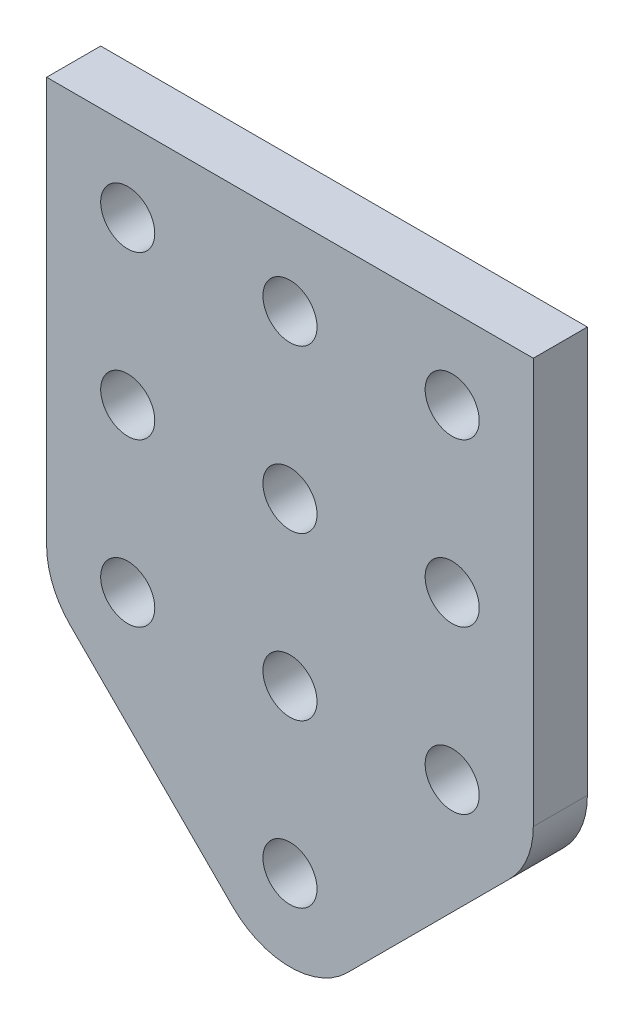
ISO-10303-21;
HEADER;
FILE_DESCRIPTION(('STEP AP214'),'2;1');
FILE_NAME('part.step','',(''),(''),'','','');
FILE_SCHEMA(('AUTOMOTIVE_DESIGN { 1 0 10303 214 1 1 1 1 }'));
ENDSEC;
DATA;
#1=APPLICATION_CONTEXT('core data for automotive mechanical design processes');
#2=APPLICATION_PROTOCOL_DEFINITION('international standard','automotive_design',2000,#1);
#3=PRODUCT_CONTEXT('',#1,'mechanical');
#4=PRODUCT('Part','Part','',(#3));
#5=PRODUCT_RELATED_PRODUCT_CATEGORY('part','',(#4));
#6=PRODUCT_DEFINITION_FORMATION('','',#4);
#7=PRODUCT_DEFINITION_CONTEXT('part definition',#1,'design');
#8=PRODUCT_DEFINITION('design','',#6,#7);
#9=PRODUCT_DEFINITION_SHAPE('','',#8);
#10=(LENGTH_UNIT() NAMED_UNIT(*) SI_UNIT(.MILLI.,.METRE.));
#11=(NAMED_UNIT(*) PLANE_ANGLE_UNIT() SI_UNIT($,.RADIAN.));
#12=(NAMED_UNIT(*) SI_UNIT($,.STERADIAN.) SOLID_ANGLE_UNIT());
#13=UNCERTAINTY_MEASURE_WITH_UNIT(LENGTH_MEASURE(1.E-05),#10,'distance_accuracy_value','');
#14=(GEOMETRIC_REPRESENTATION_CONTEXT(3) GLOBAL_UNCERTAINTY_ASSIGNED_CONTEXT((#13)) GLOBAL_UNIT_ASSIGNED_CONTEXT((#10,
#11,#12)) REPRESENTATION_CONTEXT('',''));
#15=CARTESIAN_POINT('',(0.,0.,0.));
#16=DIRECTION('',(0.,0.,1.));
#17=DIRECTION('',(1.,0.,0.));
#18=AXIS2_PLACEMENT_3D('',#15,#16,#17);
#19=CARTESIAN_POINT('',(187.7270545748,195.1787200631,3.));
#20=DIRECTION('',(0.,0.,1.));
#21=DIRECTION('',(1.,0.,0.));
#22=AXIS2_PLACEMENT_3D('',#19,#20,#21);
#23=PLANE('',#22);
#24=CARTESIAN_POINT('',(178.7270545748,222.1787200631,3.));
#25=DIRECTION('',(0.,0.,1.));
#26=DIRECTION('',(1.,0.,0.));
#27=AXIS2_PLACEMENT_3D('',#24,#25,#26);
#28=CIRCLE('',#27,1.5);
#29=CARTESIAN_POINT('',(180.2270545748,222.1787200631,3.));
#30=VERTEX_POINT('',#29);
#31=EDGE_CURVE('E224',#30,#30,#28,.T.);
#32=ORIENTED_EDGE('',*,*,#31,.F.);
#33=EDGE_LOOP('',(#32));
#34=FACE_BOUND('',#33,.T.);
#35=CARTESIAN_POINT('',(196.7270545748,204.1787200631,3.));
#36=DIRECTION('',(0.,0.,1.));
#37=DIRECTION('',(1.,0.,0.));
#38=AXIS2_PLACEMENT_3D('',#35,#36,#37);
#39=CIRCLE('',#38,1.5);
#40=CARTESIAN_POINT('',(198.2270545748,204.1787200631,3.));
#41=VERTEX_POINT('',#40);
#42=EDGE_CURVE('E212',#41,#41,#39,.T.);
#43=ORIENTED_EDGE('',*,*,#42,.F.);
#44=EDGE_LOOP('',(#43));
#45=FACE_BOUND('',#44,.T.);
#46=CARTESIAN_POINT('',(196.7270545748,213.1787200631,3.));
#47=DIRECTION('',(0.,0.,1.));
#48=DIRECTION('',(1.,0.,0.));
#49=AXIS2_PLACEMENT_3D('',#46,#47,#48);
#50=CIRCLE('',#49,1.5);
#51=CARTESIAN_POINT('',(198.2270545748,213.1787200631,3.));
#52=VERTEX_POINT('',#51);
#53=EDGE_CURVE('E200',#52,#52,#50,.T.);
#54=ORIENTED_EDGE('',*,*,#53,.F.);
#55=EDGE_LOOP('',(#54));
#56=FACE_BOUND('',#55,.T.);
#57=CARTESIAN_POINT('',(187.7270545748,213.1787200631,3.));
#58=DIRECTION('',(0.,0.,1.));
#59=DIRECTION('',(1.,0.,0.));
#60=AXIS2_PLACEMENT_3D('',#57,#58,#59);
#61=CIRCLE('',#60,1.5);
#62=CARTESIAN_POINT('',(189.2270545748,213.1787200631,3.));
#63=VERTEX_POINT('',#62);
#64=EDGE_CURVE('E188',#63,#63,#61,.T.);
#65=ORIENTED_EDGE('',*,*,#64,.F.);
#66=EDGE_LOOP('',(#65));
#67=FACE_BOUND('',#66,.T.);
#68=CARTESIAN_POINT('',(187.7270545748,204.1787200631,3.));
#69=DIRECTION('',(0.,0.,1.));
#70=DIRECTION('',(1.,0.,0.));
#71=AXIS2_PLACEMENT_3D('',#68,#69,#70);
#72=CIRCLE('',#71,1.5);
#73=CARTESIAN_POINT('',(189.2270545748,204.1787200631,3.));
#74=VERTEX_POINT('',#73);
#75=EDGE_CURVE('E133',#74,#74,#72,.T.);
#76=ORIENTED_EDGE('',*,*,#75,.F.);
#77=EDGE_LOOP('',(#76));
#78=FACE_BOUND('',#77,.T.);
#79=CARTESIAN_POINT('',(187.7270545748,195.1787200631,3.));
#80=DIRECTION('',(0.,0.,1.));
#81=DIRECTION('',(1.,0.,0.));
#82=AXIS2_PLACEMENT_3D('',#79,#80,#81);
#83=CIRCLE('',#82,4.50000000005025);
#84=CARTESIAN_POINT('',(184.5450740594,191.9967395477,3.));
#85=VERTEX_POINT('',#84);
#86=CARTESIAN_POINT('',(190.9090350901,191.9967395477,3.));
#87=VERTEX_POINT('',#86);
#88=EDGE_CURVE('E145',#85,#87,#83,.T.);
#89=ORIENTED_EDGE('',*,*,#88,.T.);
#90=DIRECTION('',(0.707106781186548,0.707106781186548,0.));
#91=VECTOR('',#90,1.);
#92=CARTESIAN_POINT('',(190.9090350901,191.9967395477,3.));
#93=LINE('',#92,#91);
#94=CARTESIAN_POINT('',(199.909035090095,200.996739547705,3.));
#95=VERTEX_POINT('',#94);
#96=EDGE_CURVE('E93',#87,#95,#93,.T.);
#97=ORIENTED_EDGE('',*,*,#96,.T.);
#98=CARTESIAN_POINT('',(196.7270545748,204.1787200631,3.));
#99=DIRECTION('',(0.,0.,1.));
#100=DIRECTION('',(1.,0.,0.));
#101=AXIS2_PLACEMENT_3D('',#98,#99,#100);
#102=CIRCLE('',#101,4.50000000000745);
#103=CARTESIAN_POINT('',(201.2270545748,204.1787200631,3.));
#104=VERTEX_POINT('',#103);
#105=EDGE_CURVE('E160',#95,#104,#102,.T.);
#106=ORIENTED_EDGE('',*,*,#105,.T.);
#107=DIRECTION('',(0.,1.,0.));
#108=VECTOR('',#107,1.);
#109=CARTESIAN_POINT('',(201.2270545748,226.6787200631,3.));
#110=LINE('',#109,#108);
#111=CARTESIAN_POINT('',(201.2270545748,226.6787200631,3.));
#112=VERTEX_POINT('',#111);
#113=EDGE_CURVE('E173',#104,#112,#110,.T.);
#114=ORIENTED_EDGE('',*,*,#113,.T.);
#115=DIRECTION('',(-1.,0.,0.));
#116=VECTOR('',#115,1.);
#117=CARTESIAN_POINT('',(201.2270545748,226.6787200631,3.));
#118=LINE('',#117,#116);
#119=CARTESIAN_POINT('',(174.2270545748,226.6787200631,3.));
#120=VERTEX_POINT('',#119);
#121=EDGE_CURVE('E112',#112,#120,#118,.T.);
#122=ORIENTED_EDGE('',*,*,#121,.T.);
#123=DIRECTION('',(0.,-1.,0.));
#124=VECTOR('',#123,1.);
#125=CARTESIAN_POINT('',(174.2270545748,213.1787200631,3.));
#126=LINE('',#125,#124);
#127=CARTESIAN_POINT('',(174.227054574757,204.1787200631,3.));
#128=VERTEX_POINT('',#127);
#129=EDGE_CURVE('E106',#120,#128,#126,.T.);
#130=ORIENTED_EDGE('',*,*,#129,.T.);
#131=CARTESIAN_POINT('',(178.7270545748,204.1787200631,3.));
#132=DIRECTION('',(0.,0.,1.));
#133=DIRECTION('',(1.,0.,0.));
#134=AXIS2_PLACEMENT_3D('',#131,#132,#133);
#135=CIRCLE('',#134,4.50000000004281);
#136=CARTESIAN_POINT('',(175.5450740594,200.9967395477,3.));
#137=VERTEX_POINT('',#136);
#138=EDGE_CURVE('E110',#128,#137,#135,.T.);
#139=ORIENTED_EDGE('',*,*,#138,.T.);
#140=DIRECTION('',(0.707106781186548,-0.707106781186548,0.));
#141=VECTOR('',#140,1.);
#142=CARTESIAN_POINT('',(184.5450740594,191.9967395477,3.));
#143=LINE('',#142,#141);
#144=EDGE_CURVE('E50',#137,#85,#143,.T.);
#145=ORIENTED_EDGE('',*,*,#144,.T.);
#146=EDGE_LOOP('',(#89,#97,#106,#114,#122,#130,#139,#145));
#147=FACE_BOUND('',#146,.T.);
#148=CARTESIAN_POINT('',(178.7270545748,204.1787200631,3.));
#149=DIRECTION('',(0.,0.,1.));
#150=DIRECTION('',(1.,0.,0.));
#151=AXIS2_PLACEMENT_3D('',#148,#149,#150);
#152=CIRCLE('',#151,1.5);
#153=CARTESIAN_POINT('',(180.2270545748,204.1787200631,3.));
#154=VERTEX_POINT('',#153);
#155=EDGE_CURVE('E182',#154,#154,#152,.T.);
#156=ORIENTED_EDGE('',*,*,#155,.F.);
#157=EDGE_LOOP('',(#156));
#158=FACE_BOUND('',#157,.T.);
#159=CARTESIAN_POINT('',(178.7270545748,213.1787200631,3.));
#160=DIRECTION('',(0.,0.,1.));
#161=DIRECTION('',(1.,0.,0.));
#162=AXIS2_PLACEMENT_3D('',#159,#160,#161);
#163=CIRCLE('',#162,1.5);
#164=CARTESIAN_POINT('',(180.2270545748,213.1787200631,3.));
#165=VERTEX_POINT('',#164);
#166=EDGE_CURVE('E194',#165,#165,#163,.T.);
#167=ORIENTED_EDGE('',*,*,#166,.F.);
#168=EDGE_LOOP('',(#167));
#169=FACE_BOUND('',#168,.T.);
#170=CARTESIAN_POINT('',(187.7270545748,195.1787200631,3.));
#171=DIRECTION('',(0.,0.,1.));
#172=DIRECTION('',(1.,0.,0.));
#173=AXIS2_PLACEMENT_3D('',#170,#171,#172);
#174=CIRCLE('',#173,1.5);
#175=CARTESIAN_POINT('',(189.2270545748,195.1787200631,3.));
#176=VERTEX_POINT('',#175);
#177=EDGE_CURVE('E206',#176,#176,#174,.T.);
#178=ORIENTED_EDGE('',*,*,#177,.F.);
#179=EDGE_LOOP('',(#178));
#180=FACE_BOUND('',#179,.T.);
#181=CARTESIAN_POINT('',(187.7270545748,222.1787200631,3.));
#182=DIRECTION('',(0.,0.,1.));
#183=DIRECTION('',(1.,0.,0.));
#184=AXIS2_PLACEMENT_3D('',#181,#182,#183);
#185=CIRCLE('',#184,1.5);
#186=CARTESIAN_POINT('',(189.2270545748,222.1787200631,3.));
#187=VERTEX_POINT('',#186);
#188=EDGE_CURVE('E218',#187,#187,#185,.T.);
#189=ORIENTED_EDGE('',*,*,#188,.F.);
#190=EDGE_LOOP('',(#189));
#191=FACE_BOUND('',#190,.T.);
#192=CARTESIAN_POINT('',(196.7270545748,222.1787200631,3.));
#193=DIRECTION('',(0.,0.,1.));
#194=DIRECTION('',(1.,0.,0.));
#195=AXIS2_PLACEMENT_3D('',#192,#193,#194);
#196=CIRCLE('',#195,1.5);
#197=CARTESIAN_POINT('',(198.2270545748,222.1787200631,3.));
#198=VERTEX_POINT('',#197);
#199=EDGE_CURVE('E230',#198,#198,#196,.T.);
#200=ORIENTED_EDGE('',*,*,#199,.F.);
#201=EDGE_LOOP('',(#200));
#202=FACE_BOUND('',#201,.T.);
#203=ADVANCED_FACE('F33',(#34,#45,#56,#67,#78,#147,#158,#169,#180,#191,#202),#23,.T.);
#204=CARTESIAN_POINT('',(187.7270545748,195.1787200631,0.));
#205=DIRECTION('',(0.,0.,1.));
#206=DIRECTION('',(1.,0.,0.));
#207=AXIS2_PLACEMENT_3D('',#204,#205,#206);
#208=PLANE('',#207);
#209=CARTESIAN_POINT('',(178.7270545748,222.1787200631,0.));
#210=DIRECTION('',(0.,0.,1.));
#211=DIRECTION('',(1.,0.,0.));
#212=AXIS2_PLACEMENT_3D('',#209,#210,#211);
#213=CIRCLE('',#212,1.5);
#214=CARTESIAN_POINT('',(180.2270545748,222.1787200631,0.));
#215=VERTEX_POINT('',#214);
#216=EDGE_CURVE('E227',#215,#215,#213,.T.);
#217=ORIENTED_EDGE('',*,*,#216,.T.);
#218=EDGE_LOOP('',(#217));
#219=FACE_BOUND('',#218,.T.);
#220=CARTESIAN_POINT('',(196.7270545748,204.1787200631,0.));
#221=DIRECTION('',(0.,0.,1.));
#222=DIRECTION('',(1.,0.,0.));
#223=AXIS2_PLACEMENT_3D('',#220,#221,#222);
#224=CIRCLE('',#223,1.5);
#225=CARTESIAN_POINT('',(198.2270545748,204.1787200631,0.));
#226=VERTEX_POINT('',#225);
#227=EDGE_CURVE('E215',#226,#226,#224,.T.);
#228=ORIENTED_EDGE('',*,*,#227,.T.);
#229=EDGE_LOOP('',(#228));
#230=FACE_BOUND('',#229,.T.);
#231=CARTESIAN_POINT('',(196.7270545748,213.1787200631,0.));
#232=DIRECTION('',(0.,0.,1.));
#233=DIRECTION('',(1.,0.,0.));
#234=AXIS2_PLACEMENT_3D('',#231,#232,#233);
#235=CIRCLE('',#234,1.5);
#236=CARTESIAN_POINT('',(198.2270545748,213.1787200631,0.));
#237=VERTEX_POINT('',#236);
#238=EDGE_CURVE('E203',#237,#237,#235,.T.);
#239=ORIENTED_EDGE('',*,*,#238,.T.);
#240=EDGE_LOOP('',(#239));
#241=FACE_BOUND('',#240,.T.);
#242=CARTESIAN_POINT('',(187.7270545748,213.1787200631,0.));
#243=DIRECTION('',(0.,0.,1.));
#244=DIRECTION('',(1.,0.,0.));
#245=AXIS2_PLACEMENT_3D('',#242,#243,#244);
#246=CIRCLE('',#245,1.5);
#247=CARTESIAN_POINT('',(189.2270545748,213.1787200631,0.));
#248=VERTEX_POINT('',#247);
#249=EDGE_CURVE('E191',#248,#248,#246,.T.);
#250=ORIENTED_EDGE('',*,*,#249,.T.);
#251=EDGE_LOOP('',(#250));
#252=FACE_BOUND('',#251,.T.);
#253=CARTESIAN_POINT('',(187.7270545748,204.1787200631,0.));
#254=DIRECTION('',(0.,0.,1.));
#255=DIRECTION('',(1.,0.,0.));
#256=AXIS2_PLACEMENT_3D('',#253,#254,#255);
#257=CIRCLE('',#256,1.5);
#258=CARTESIAN_POINT('',(189.2270545748,204.1787200631,0.));
#259=VERTEX_POINT('',#258);
#260=EDGE_CURVE('E179',#259,#259,#257,.T.);
#261=ORIENTED_EDGE('',*,*,#260,.T.);
#262=EDGE_LOOP('',(#261));
#263=FACE_BOUND('',#262,.T.);
#264=CARTESIAN_POINT('',(187.7270545748,195.1787200631,0.));
#265=DIRECTION('',(0.,0.,1.));
#266=DIRECTION('',(1.,0.,0.));
#267=AXIS2_PLACEMENT_3D('',#264,#265,#266);
#268=CIRCLE('',#267,4.50000000005025);
#269=CARTESIAN_POINT('',(184.5450740594,191.9967395477,0.));
#270=VERTEX_POINT('',#269);
#271=CARTESIAN_POINT('',(190.9090350901,191.9967395477,0.));
#272=VERTEX_POINT('',#271);
#273=EDGE_CURVE('E129',#270,#272,#268,.T.);
#274=ORIENTED_EDGE('',*,*,#273,.F.);
#275=DIRECTION('',(0.707106781186548,-0.707106781186548,0.));
#276=VECTOR('',#275,1.);
#277=CARTESIAN_POINT('',(184.5450740594,191.9967395477,0.));
#278=LINE('',#277,#276);
#279=CARTESIAN_POINT('',(175.5450740594,200.9967395477,0.));
#280=VERTEX_POINT('',#279);
#281=EDGE_CURVE('E85',#280,#270,#278,.T.);
#282=ORIENTED_EDGE('',*,*,#281,.F.);
#283=CARTESIAN_POINT('',(178.7270545748,204.1787200631,0.));
#284=DIRECTION('',(0.,0.,1.));
#285=DIRECTION('',(1.,0.,0.));
#286=AXIS2_PLACEMENT_3D('',#283,#284,#285);
#287=CIRCLE('',#286,4.50000000004281);
#288=CARTESIAN_POINT('',(174.227054574757,204.1787200631,0.));
#289=VERTEX_POINT('',#288);
#290=EDGE_CURVE('E79',#289,#280,#287,.T.);
#291=ORIENTED_EDGE('',*,*,#290,.F.);
#292=DIRECTION('',(0.,-1.,0.));
#293=VECTOR('',#292,1.);
#294=CARTESIAN_POINT('',(174.2270545748,213.1787200631,0.));
#295=LINE('',#294,#293);
#296=CARTESIAN_POINT('',(174.2270545748,226.6787200631,0.));
#297=VERTEX_POINT('',#296);
#298=EDGE_CURVE('E119',#297,#289,#295,.T.);
#299=ORIENTED_EDGE('',*,*,#298,.F.);
#300=DIRECTION('',(-1.,0.,0.));
#301=VECTOR('',#300,1.);
#302=CARTESIAN_POINT('',(201.2270545748,226.6787200631,0.));
#303=LINE('',#302,#301);
#304=CARTESIAN_POINT('',(201.2270545748,226.6787200631,0.));
#305=VERTEX_POINT('',#304);
#306=EDGE_CURVE('E139',#305,#297,#303,.T.);
#307=ORIENTED_EDGE('',*,*,#306,.F.);
#308=DIRECTION('',(0.,1.,0.));
#309=VECTOR('',#308,1.);
#310=CARTESIAN_POINT('',(201.2270545748,226.6787200631,0.));
#311=LINE('',#310,#309);
#312=CARTESIAN_POINT('',(201.2270545748,204.1787200631,0.));
#313=VERTEX_POINT('',#312);
#314=EDGE_CURVE('E137',#313,#305,#311,.T.);
#315=ORIENTED_EDGE('',*,*,#314,.F.);
#316=CARTESIAN_POINT('',(196.7270545748,204.1787200631,0.));
#317=DIRECTION('',(0.,0.,1.));
#318=DIRECTION('',(1.,0.,0.));
#319=AXIS2_PLACEMENT_3D('',#316,#317,#318);
#320=CIRCLE('',#319,4.50000000000745);
#321=CARTESIAN_POINT('',(199.909035090095,200.996739547705,0.));
#322=VERTEX_POINT('',#321);
#323=EDGE_CURVE('E135',#322,#313,#320,.T.);
#324=ORIENTED_EDGE('',*,*,#323,.F.);
#325=DIRECTION('',(0.707106781186548,0.707106781186548,0.));
#326=VECTOR('',#325,1.);
#327=CARTESIAN_POINT('',(190.9090350901,191.9967395477,0.));
#328=LINE('',#327,#326);
#329=EDGE_CURVE('E132',#272,#322,#328,.T.);
#330=ORIENTED_EDGE('',*,*,#329,.F.);
#331=EDGE_LOOP('',(#274,#282,#291,#299,#307,#315,#324,#330));
#332=FACE_BOUND('',#331,.T.);
#333=CARTESIAN_POINT('',(178.7270545748,204.1787200631,0.));
#334=DIRECTION('',(0.,0.,1.));
#335=DIRECTION('',(1.,0.,0.));
#336=AXIS2_PLACEMENT_3D('',#333,#334,#335);
#337=CIRCLE('',#336,1.5);
#338=CARTESIAN_POINT('',(180.2270545748,204.1787200631,0.));
#339=VERTEX_POINT('',#338);
#340=EDGE_CURVE('E185',#339,#339,#337,.T.);
#341=ORIENTED_EDGE('',*,*,#340,.T.);
#342=EDGE_LOOP('',(#341));
#343=FACE_BOUND('',#342,.T.);
#344=CARTESIAN_POINT('',(178.7270545748,213.1787200631,0.));
#345=DIRECTION('',(0.,0.,1.));
#346=DIRECTION('',(1.,0.,0.));
#347=AXIS2_PLACEMENT_3D('',#344,#345,#346);
#348=CIRCLE('',#347,1.5);
#349=CARTESIAN_POINT('',(180.2270545748,213.1787200631,0.));
#350=VERTEX_POINT('',#349);
#351=EDGE_CURVE('E197',#350,#350,#348,.T.);
#352=ORIENTED_EDGE('',*,*,#351,.T.);
#353=EDGE_LOOP('',(#352));
#354=FACE_BOUND('',#353,.T.);
#355=CARTESIAN_POINT('',(187.7270545748,195.1787200631,0.));
#356=DIRECTION('',(0.,0.,1.));
#357=DIRECTION('',(1.,0.,0.));
#358=AXIS2_PLACEMENT_3D('',#355,#356,#357);
#359=CIRCLE('',#358,1.5);
#360=CARTESIAN_POINT('',(189.2270545748,195.1787200631,0.));
#361=VERTEX_POINT('',#360);
#362=EDGE_CURVE('E209',#361,#361,#359,.T.);
#363=ORIENTED_EDGE('',*,*,#362,.T.);
#364=EDGE_LOOP('',(#363));
#365=FACE_BOUND('',#364,.T.);
#366=CARTESIAN_POINT('',(187.7270545748,222.1787200631,0.));
#367=DIRECTION('',(0.,0.,1.));
#368=DIRECTION('',(1.,0.,0.));
#369=AXIS2_PLACEMENT_3D('',#366,#367,#368);
#370=CIRCLE('',#369,1.5);
#371=CARTESIAN_POINT('',(189.2270545748,222.1787200631,0.));
#372=VERTEX_POINT('',#371);
#373=EDGE_CURVE('E221',#372,#372,#370,.T.);
#374=ORIENTED_EDGE('',*,*,#373,.T.);
#375=EDGE_LOOP('',(#374));
#376=FACE_BOUND('',#375,.T.);
#377=CARTESIAN_POINT('',(196.7270545748,222.1787200631,0.));
#378=DIRECTION('',(0.,0.,1.));
#379=DIRECTION('',(1.,0.,0.));
#380=AXIS2_PLACEMENT_3D('',#377,#378,#379);
#381=CIRCLE('',#380,1.5);
#382=CARTESIAN_POINT('',(198.2270545748,222.1787200631,0.));
#383=VERTEX_POINT('',#382);
#384=EDGE_CURVE('E233',#383,#383,#381,.T.);
#385=ORIENTED_EDGE('',*,*,#384,.T.);
#386=EDGE_LOOP('',(#385));
#387=FACE_BOUND('',#386,.T.);
#388=ADVANCED_FACE('F164',(#219,#230,#241,#252,#263,#332,#343,#354,#365,#376,#387),#208,.F.);
#389=CARTESIAN_POINT('',(187.7270545748,195.1787200631,3.));
#390=DIRECTION('',(0.,0.,-1.));
#391=DIRECTION('',(-1.,0.,0.));
#392=AXIS2_PLACEMENT_3D('',#389,#390,#391);
#393=CYLINDRICAL_SURFACE('',#392,4.50000000005025);
#394=ORIENTED_EDGE('',*,*,#273,.T.);
#395=DIRECTION('',(0.,0.,-1.));
#396=VECTOR('',#395,1.);
#397=CARTESIAN_POINT('',(190.9090350901,191.9967395477,3.));
#398=LINE('',#397,#396);
#399=EDGE_CURVE('E11',#87,#272,#398,.T.);
#400=ORIENTED_EDGE('',*,*,#399,.F.);
#401=ORIENTED_EDGE('',*,*,#88,.F.);
#402=DIRECTION('',(0.,0.,-1.));
#403=VECTOR('',#402,1.);
#404=CARTESIAN_POINT('',(184.5450740594,191.9967395477,3.));
#405=LINE('',#404,#403);
#406=EDGE_CURVE('E125',#85,#270,#405,.T.);
#407=ORIENTED_EDGE('',*,*,#406,.T.);
#408=EDGE_LOOP('',(#394,#400,#401,#407));
#409=FACE_BOUND('',#408,.T.);
#410=ADVANCED_FACE('F35',(#409),#393,.T.);
#411=CARTESIAN_POINT('',(190.9090350901,191.9967395477,3.));
#412=DIRECTION('',(-0.707106781186547,0.707106781186547,0.));
#413=DIRECTION('',(-0.707106781186548,-0.707106781186548,0.));
#414=AXIS2_PLACEMENT_3D('',#411,#412,#413);
#415=PLANE('',#414);
#416=ORIENTED_EDGE('',*,*,#329,.T.);
#417=DIRECTION('',(0.,0.,-1.));
#418=VECTOR('',#417,1.);
#419=CARTESIAN_POINT('',(199.909035090095,200.996739547705,3.));
#420=LINE('',#419,#418);
#421=EDGE_CURVE('E42',#95,#322,#420,.T.);
#422=ORIENTED_EDGE('',*,*,#421,.F.);
#423=ORIENTED_EDGE('',*,*,#96,.F.);
#424=ORIENTED_EDGE('',*,*,#399,.T.);
#425=EDGE_LOOP('',(#416,#422,#423,#424));
#426=FACE_BOUND('',#425,.T.);
#427=ADVANCED_FACE('F268',(#426),#415,.F.);
#428=CARTESIAN_POINT('',(196.7270545748,204.1787200631,3.));
#429=DIRECTION('',(0.,0.,-1.));
#430=DIRECTION('',(-1.,0.,0.));
#431=AXIS2_PLACEMENT_3D('',#428,#429,#430);
#432=CYLINDRICAL_SURFACE('',#431,4.50000000000745);
#433=ORIENTED_EDGE('',*,*,#323,.T.);
#434=DIRECTION('',(0.,0.,-1.));
#435=VECTOR('',#434,1.);
#436=CARTESIAN_POINT('',(201.2270545748,204.1787200631,3.));
#437=LINE('',#436,#435);
#438=EDGE_CURVE('E152',#104,#313,#437,.T.);
#439=ORIENTED_EDGE('',*,*,#438,.F.);
#440=ORIENTED_EDGE('',*,*,#105,.F.);
#441=ORIENTED_EDGE('',*,*,#421,.T.);
#442=EDGE_LOOP('',(#433,#439,#440,#441));
#443=FACE_BOUND('',#442,.T.);
#444=ADVANCED_FACE('F158',(#443),#432,.T.);
#445=CARTESIAN_POINT('',(201.2270545748,226.6787200631,3.));
#446=DIRECTION('',(-1.,0.,0.));
#447=DIRECTION('',(0.,0.,1.));
#448=AXIS2_PLACEMENT_3D('',#445,#446,#447);
#449=PLANE('',#448);
#450=ORIENTED_EDGE('',*,*,#314,.T.);
#451=DIRECTION('',(0.,0.,-1.));
#452=VECTOR('',#451,1.);
#453=CARTESIAN_POINT('',(201.2270545748,226.6787200631,3.));
#454=LINE('',#453,#452);
#455=EDGE_CURVE('E149',#112,#305,#454,.T.);
#456=ORIENTED_EDGE('',*,*,#455,.F.);
#457=ORIENTED_EDGE('',*,*,#113,.F.);
#458=ORIENTED_EDGE('',*,*,#438,.T.);
#459=EDGE_LOOP('',(#450,#456,#457,#458));
#460=FACE_BOUND('',#459,.T.);
#461=ADVANCED_FACE('F169',(#460),#449,.F.);
#462=CARTESIAN_POINT('',(201.2270545748,226.6787200631,3.));
#463=DIRECTION('',(0.,-1.,0.));
#464=DIRECTION('',(0.,0.,-1.));
#465=AXIS2_PLACEMENT_3D('',#462,#463,#464);
#466=PLANE('',#465);
#467=ORIENTED_EDGE('',*,*,#306,.T.);
#468=DIRECTION('',(0.,0.,-1.));
#469=VECTOR('',#468,1.);
#470=CARTESIAN_POINT('',(174.2270545748,226.6787200631,3.));
#471=LINE('',#470,#469);
#472=EDGE_CURVE('E120',#120,#297,#471,.T.);
#473=ORIENTED_EDGE('',*,*,#472,.F.);
#474=ORIENTED_EDGE('',*,*,#121,.F.);
#475=ORIENTED_EDGE('',*,*,#455,.T.);
#476=EDGE_LOOP('',(#467,#473,#474,#475));
#477=FACE_BOUND('',#476,.T.);
#478=ADVANCED_FACE('F172',(#477),#466,.F.);
#479=CARTESIAN_POINT('',(174.2270545748,213.1787200631,3.));
#480=DIRECTION('',(1.,0.,0.));
#481=DIRECTION('',(0.,0.,-1.));
#482=AXIS2_PLACEMENT_3D('',#479,#480,#481);
#483=PLANE('',#482);
#484=ORIENTED_EDGE('',*,*,#298,.T.);
#485=DIRECTION('',(0.,0.,-1.));
#486=VECTOR('',#485,1.);
#487=CARTESIAN_POINT('',(174.227054574757,204.1787200631,3.));
#488=LINE('',#487,#486);
#489=EDGE_CURVE('E117',#128,#289,#488,.T.);
#490=ORIENTED_EDGE('',*,*,#489,.F.);
#491=ORIENTED_EDGE('',*,*,#129,.F.);
#492=ORIENTED_EDGE('',*,*,#472,.T.);
#493=EDGE_LOOP('',(#484,#490,#491,#492));
#494=FACE_BOUND('',#493,.T.);
#495=ADVANCED_FACE('F118',(#494),#483,.F.);
#496=CARTESIAN_POINT('',(178.7270545748,204.1787200631,3.));
#497=DIRECTION('',(0.,0.,-1.));
#498=DIRECTION('',(-1.,0.,0.));
#499=AXIS2_PLACEMENT_3D('',#496,#497,#498);
#500=CYLINDRICAL_SURFACE('',#499,4.50000000004281);
#501=ORIENTED_EDGE('',*,*,#290,.T.);
#502=DIRECTION('',(0.,0.,-1.));
#503=VECTOR('',#502,1.);
#504=CARTESIAN_POINT('',(175.5450740594,200.9967395477,3.));
#505=LINE('',#504,#503);
#506=EDGE_CURVE('E121',#137,#280,#505,.T.);
#507=ORIENTED_EDGE('',*,*,#506,.F.);
#508=ORIENTED_EDGE('',*,*,#138,.F.);
#509=ORIENTED_EDGE('',*,*,#489,.T.);
#510=EDGE_LOOP('',(#501,#507,#508,#509));
#511=FACE_BOUND('',#510,.T.);
#512=ADVANCED_FACE('F123',(#511),#500,.T.);
#513=CARTESIAN_POINT('',(184.5450740594,191.9967395477,3.));
#514=DIRECTION('',(0.707106781186547,0.707106781186547,0.));
#515=DIRECTION('',(-0.707106781186548,0.707106781186548,0.));
#516=AXIS2_PLACEMENT_3D('',#513,#514,#515);
#517=PLANE('',#516);
#518=ORIENTED_EDGE('',*,*,#281,.T.);
#519=ORIENTED_EDGE('',*,*,#406,.F.);
#520=ORIENTED_EDGE('',*,*,#144,.F.);
#521=ORIENTED_EDGE('',*,*,#506,.T.);
#522=EDGE_LOOP('',(#518,#519,#520,#521));
#523=FACE_BOUND('',#522,.T.);
#524=ADVANCED_FACE('F256',(#523),#517,.F.);
#525=CARTESIAN_POINT('',(187.7270545748,204.1787200631,3.));
#526=DIRECTION('',(0.,0.,-1.));
#527=DIRECTION('',(-1.,0.,0.));
#528=AXIS2_PLACEMENT_3D('',#525,#526,#527);
#529=CYLINDRICAL_SURFACE('',#528,1.5);
#530=ORIENTED_EDGE('',*,*,#75,.T.);
#531=EDGE_LOOP('',(#530));
#532=FACE_BOUND('',#531,.T.);
#533=ORIENTED_EDGE('',*,*,#260,.F.);
#534=EDGE_LOOP('',(#533));
#535=FACE_BOUND('',#534,.T.);
#536=ADVANCED_FACE('F253',(#532,#535),#529,.F.);
#537=CARTESIAN_POINT('',(178.7270545748,204.1787200631,3.));
#538=DIRECTION('',(0.,0.,-1.));
#539=DIRECTION('',(-1.,0.,0.));
#540=AXIS2_PLACEMENT_3D('',#537,#538,#539);
#541=CYLINDRICAL_SURFACE('',#540,1.5);
#542=ORIENTED_EDGE('',*,*,#155,.T.);
#543=EDGE_LOOP('',(#542));
#544=FACE_BOUND('',#543,.T.);
#545=ORIENTED_EDGE('',*,*,#340,.F.);
#546=EDGE_LOOP('',(#545));
#547=FACE_BOUND('',#546,.T.);
#548=ADVANCED_FACE('F335',(#544,#547),#541,.F.);
#549=CARTESIAN_POINT('',(187.7270545748,213.1787200631,3.));
#550=DIRECTION('',(0.,0.,-1.));
#551=DIRECTION('',(-1.,0.,0.));
#552=AXIS2_PLACEMENT_3D('',#549,#550,#551);
#553=CYLINDRICAL_SURFACE('',#552,1.5);
#554=ORIENTED_EDGE('',*,*,#64,.T.);
#555=EDGE_LOOP('',(#554));
#556=FACE_BOUND('',#555,.T.);
#557=ORIENTED_EDGE('',*,*,#249,.F.);
#558=EDGE_LOOP('',(#557));
#559=FACE_BOUND('',#558,.T.);
#560=ADVANCED_FACE('F343',(#556,#559),#553,.F.);
#561=CARTESIAN_POINT('',(178.7270545748,213.1787200631,3.));
#562=DIRECTION('',(0.,0.,-1.));
#563=DIRECTION('',(-1.,0.,0.));
#564=AXIS2_PLACEMENT_3D('',#561,#562,#563);
#565=CYLINDRICAL_SURFACE('',#564,1.5);
#566=ORIENTED_EDGE('',*,*,#166,.T.);
#567=EDGE_LOOP('',(#566));
#568=FACE_BOUND('',#567,.T.);
#569=ORIENTED_EDGE('',*,*,#351,.F.);
#570=EDGE_LOOP('',(#569));
#571=FACE_BOUND('',#570,.T.);
#572=ADVANCED_FACE('F351',(#568,#571),#565,.F.);
#573=CARTESIAN_POINT('',(196.7270545748,213.1787200631,3.));
#574=DIRECTION('',(0.,0.,-1.));
#575=DIRECTION('',(-1.,0.,0.));
#576=AXIS2_PLACEMENT_3D('',#573,#574,#575);
#577=CYLINDRICAL_SURFACE('',#576,1.5);
#578=ORIENTED_EDGE('',*,*,#53,.T.);
#579=EDGE_LOOP('',(#578));
#580=FACE_BOUND('',#579,.T.);
#581=ORIENTED_EDGE('',*,*,#238,.F.);
#582=EDGE_LOOP('',(#581));
#583=FACE_BOUND('',#582,.T.);
#584=ADVANCED_FACE('F360',(#580,#583),#577,.F.);
#585=CARTESIAN_POINT('',(187.7270545748,195.1787200631,3.));
#586=DIRECTION('',(0.,0.,-1.));
#587=DIRECTION('',(-1.,0.,0.));
#588=AXIS2_PLACEMENT_3D('',#585,#586,#587);
#589=CYLINDRICAL_SURFACE('',#588,1.5);
#590=ORIENTED_EDGE('',*,*,#177,.T.);
#591=EDGE_LOOP('',(#590));
#592=FACE_BOUND('',#591,.T.);
#593=ORIENTED_EDGE('',*,*,#362,.F.);
#594=EDGE_LOOP('',(#593));
#595=FACE_BOUND('',#594,.T.);
#596=ADVANCED_FACE('F369',(#592,#595),#589,.F.);
#597=CARTESIAN_POINT('',(196.7270545748,204.1787200631,3.));
#598=DIRECTION('',(0.,0.,-1.));
#599=DIRECTION('',(-1.,0.,0.));
#600=AXIS2_PLACEMENT_3D('',#597,#598,#599);
#601=CYLINDRICAL_SURFACE('',#600,1.5);
#602=ORIENTED_EDGE('',*,*,#42,.T.);
#603=EDGE_LOOP('',(#602));
#604=FACE_BOUND('',#603,.T.);
#605=ORIENTED_EDGE('',*,*,#227,.F.);
#606=EDGE_LOOP('',(#605));
#607=FACE_BOUND('',#606,.T.);
#608=ADVANCED_FACE('F378',(#604,#607),#601,.F.);
#609=CARTESIAN_POINT('',(187.7270545748,222.1787200631,3.));
#610=DIRECTION('',(0.,0.,-1.));
#611=DIRECTION('',(-1.,0.,0.));
#612=AXIS2_PLACEMENT_3D('',#609,#610,#611);
#613=CYLINDRICAL_SURFACE('',#612,1.5);
#614=ORIENTED_EDGE('',*,*,#188,.T.);
#615=EDGE_LOOP('',(#614));
#616=FACE_BOUND('',#615,.T.);
#617=ORIENTED_EDGE('',*,*,#373,.F.);
#618=EDGE_LOOP('',(#617));
#619=FACE_BOUND('',#618,.T.);
#620=ADVANCED_FACE('F387',(#616,#619),#613,.F.);
#621=CARTESIAN_POINT('',(178.7270545748,222.1787200631,3.));
#622=DIRECTION('',(0.,0.,-1.));
#623=DIRECTION('',(-1.,0.,0.));
#624=AXIS2_PLACEMENT_3D('',#621,#622,#623);
#625=CYLINDRICAL_SURFACE('',#624,1.5);
#626=ORIENTED_EDGE('',*,*,#31,.T.);
#627=EDGE_LOOP('',(#626));
#628=FACE_BOUND('',#627,.T.);
#629=ORIENTED_EDGE('',*,*,#216,.F.);
#630=EDGE_LOOP('',(#629));
#631=FACE_BOUND('',#630,.T.);
#632=ADVANCED_FACE('F396',(#628,#631),#625,.F.);
#633=CARTESIAN_POINT('',(196.7270545748,222.1787200631,3.));
#634=DIRECTION('',(0.,0.,-1.));
#635=DIRECTION('',(-1.,0.,0.));
#636=AXIS2_PLACEMENT_3D('',#633,#634,#635);
#637=CYLINDRICAL_SURFACE('',#636,1.5);
#638=ORIENTED_EDGE('',*,*,#199,.T.);
#639=EDGE_LOOP('',(#638));
#640=FACE_BOUND('',#639,.T.);
#641=ORIENTED_EDGE('',*,*,#384,.F.);
#642=EDGE_LOOP('',(#641));
#643=FACE_BOUND('',#642,.T.);
#644=ADVANCED_FACE('F239',(#640,#643),#637,.F.);
#645=CLOSED_SHELL('',(#203,#388,#410,#427,#444,#461,#478,#495,#512,#524,#536,#548,#560,#572,
#584,#596,#608,#620,#632,#644));
#646=MANIFOLD_SOLID_BREP('B2',#645);
#647=ADVANCED_BREP_SHAPE_REPRESENTATION('',(#18,#646),#14);
#648=SHAPE_DEFINITION_REPRESENTATION(#9,#647);
ENDSEC;
END-ISO-10303-21;
